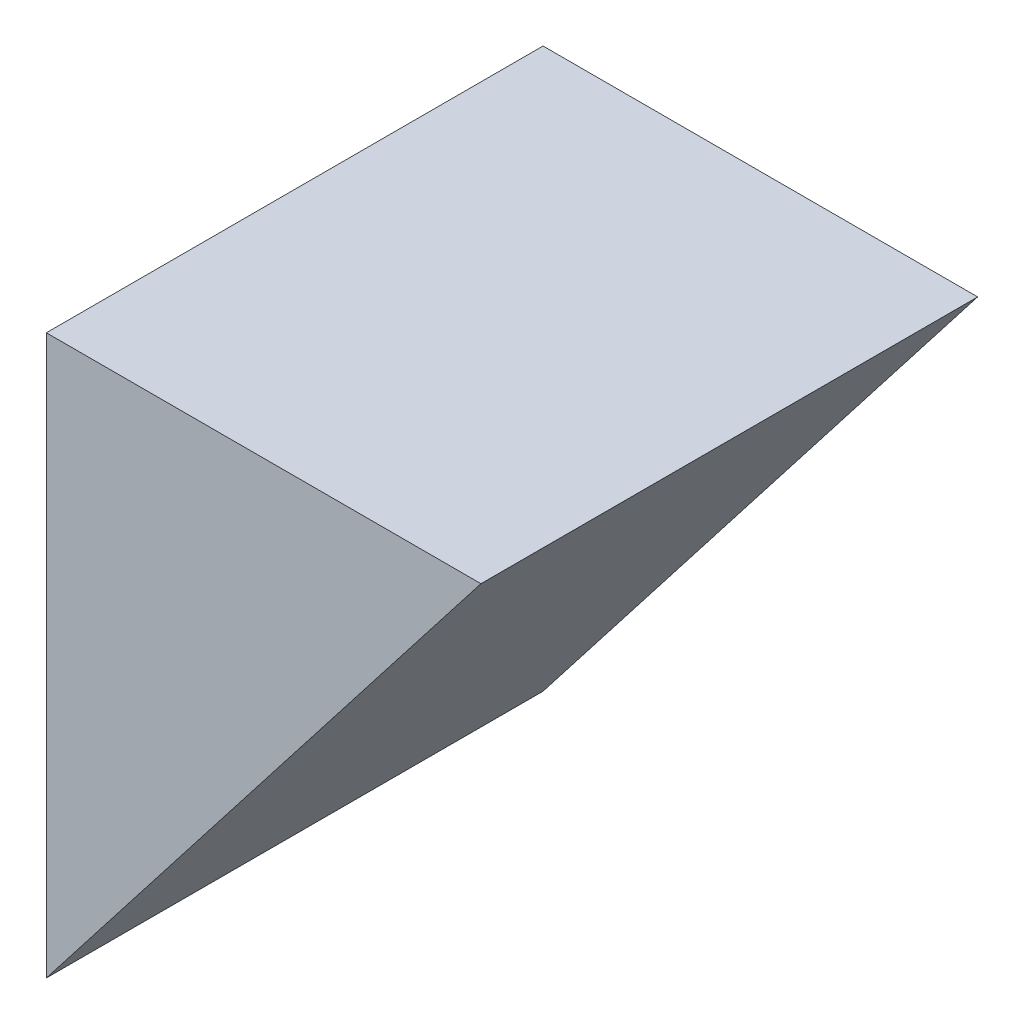
ISO-10303-21;
HEADER;
FILE_DESCRIPTION(('STEP AP214'),'2;1');
FILE_NAME('part.step','',(''),(''),'','','');
FILE_SCHEMA(('AUTOMOTIVE_DESIGN { 1 0 10303 214 1 1 1 1 }'));
ENDSEC;
DATA;
#1=APPLICATION_CONTEXT('core data for automotive mechanical design processes');
#2=APPLICATION_PROTOCOL_DEFINITION('international standard','automotive_design',2000,#1);
#3=PRODUCT_CONTEXT('',#1,'mechanical');
#4=PRODUCT('Part','Part','',(#3));
#5=PRODUCT_RELATED_PRODUCT_CATEGORY('part','',(#4));
#6=PRODUCT_DEFINITION_FORMATION('','',#4);
#7=PRODUCT_DEFINITION_CONTEXT('part definition',#1,'design');
#8=PRODUCT_DEFINITION('design','',#6,#7);
#9=PRODUCT_DEFINITION_SHAPE('','',#8);
#10=(LENGTH_UNIT() NAMED_UNIT(*) SI_UNIT(.MILLI.,.METRE.));
#11=(NAMED_UNIT(*) PLANE_ANGLE_UNIT() SI_UNIT($,.RADIAN.));
#12=(NAMED_UNIT(*) SI_UNIT($,.STERADIAN.) SOLID_ANGLE_UNIT());
#13=UNCERTAINTY_MEASURE_WITH_UNIT(LENGTH_MEASURE(1.E-05),#10,'distance_accuracy_value','');
#14=(GEOMETRIC_REPRESENTATION_CONTEXT(3) GLOBAL_UNCERTAINTY_ASSIGNED_CONTEXT((#13)) GLOBAL_UNIT_ASSIGNED_CONTEXT((#10,
#11,#12)) REPRESENTATION_CONTEXT('',''));
#15=CARTESIAN_POINT('',(0.,0.,0.));
#16=DIRECTION('',(0.,0.,1.));
#17=DIRECTION('',(1.,0.,0.));
#18=AXIS2_PLACEMENT_3D('',#15,#16,#17);
#19=CARTESIAN_POINT('',(-1.57727562282662,-13.1481471085735,-16.));
#20=DIRECTION('',(0.,-1.,0.));
#21=DIRECTION('',(0.,0.,-1.));
#22=AXIS2_PLACEMENT_3D('',#19,#20,#21);
#23=PLANE('',#22);
#24=DIRECTION('',(-1.,0.,0.));
#25=VECTOR('',#24,1.);
#26=CARTESIAN_POINT('',(-1.57727562282662,-13.1481471085735,-24.));
#27=LINE('',#26,#25);
#28=CARTESIAN_POINT('',(-1.57727562282662,-13.1481471085735,-24.));
#29=VERTEX_POINT('',#28);
#30=CARTESIAN_POINT('',(-8.57727562282662,-13.1481471085735,-24.));
#31=VERTEX_POINT('',#30);
#32=EDGE_CURVE('E79',#29,#31,#27,.T.);
#33=ORIENTED_EDGE('',*,*,#32,.T.);
#34=DIRECTION('',(0.,0.,-1.));
#35=VECTOR('',#34,1.);
#36=CARTESIAN_POINT('',(-8.57727562282662,-13.1481471085735,-16.));
#37=LINE('',#36,#35);
#38=CARTESIAN_POINT('',(-8.57727562282662,-13.1481471085735,-16.));
#39=VERTEX_POINT('',#38);
#40=EDGE_CURVE('E11',#39,#31,#37,.T.);
#41=ORIENTED_EDGE('',*,*,#40,.F.);
#42=DIRECTION('',(-1.,0.,0.));
#43=VECTOR('',#42,1.);
#44=CARTESIAN_POINT('',(-1.57727562282662,-13.1481471085735,-16.));
#45=LINE('',#44,#43);
#46=CARTESIAN_POINT('',(-1.57727562282662,-13.1481471085735,-16.));
#47=VERTEX_POINT('',#46);
#48=EDGE_CURVE('E72',#47,#39,#45,.T.);
#49=ORIENTED_EDGE('',*,*,#48,.F.);
#50=DIRECTION('',(0.,0.,-1.));
#51=VECTOR('',#50,1.);
#52=CARTESIAN_POINT('',(-1.57727562282662,-13.1481471085735,-16.));
#53=LINE('',#52,#51);
#54=EDGE_CURVE('E80',#47,#29,#53,.T.);
#55=ORIENTED_EDGE('',*,*,#54,.T.);
#56=EDGE_LOOP('',(#33,#41,#49,#55));
#57=FACE_BOUND('',#56,.T.);
#58=ADVANCED_FACE('F32',(#57),#23,.F.);
#59=CARTESIAN_POINT('',(-8.57727562282662,-13.1481471085735,-16.));
#60=DIRECTION('',(1.,0.,0.));
#61=DIRECTION('',(0.,0.,-1.));
#62=AXIS2_PLACEMENT_3D('',#59,#60,#61);
#63=PLANE('',#62);
#64=DIRECTION('',(0.,-1.,0.));
#65=VECTOR('',#64,1.);
#66=CARTESIAN_POINT('',(-8.57727562282662,-13.1481471085735,-24.));
#67=LINE('',#66,#65);
#68=CARTESIAN_POINT('',(-8.57727562282662,-22.1481471085735,-24.));
#69=VERTEX_POINT('',#68);
#70=EDGE_CURVE('E60',#31,#69,#67,.T.);
#71=ORIENTED_EDGE('',*,*,#70,.T.);
#72=DIRECTION('',(0.,0.,-1.));
#73=VECTOR('',#72,1.);
#74=CARTESIAN_POINT('',(-8.57727562282662,-22.1481471085735,-16.));
#75=LINE('',#74,#73);
#76=CARTESIAN_POINT('',(-8.57727562282662,-22.1481471085735,-16.));
#77=VERTEX_POINT('',#76);
#78=EDGE_CURVE('E40',#77,#69,#75,.T.);
#79=ORIENTED_EDGE('',*,*,#78,.F.);
#80=DIRECTION('',(0.,-1.,0.));
#81=VECTOR('',#80,1.);
#82=CARTESIAN_POINT('',(-8.57727562282662,-13.1481471085735,-16.));
#83=LINE('',#82,#81);
#84=EDGE_CURVE('E68',#39,#77,#83,.T.);
#85=ORIENTED_EDGE('',*,*,#84,.F.);
#86=ORIENTED_EDGE('',*,*,#40,.T.);
#87=EDGE_LOOP('',(#71,#79,#85,#86));
#88=FACE_BOUND('',#87,.T.);
#89=ADVANCED_FACE('F69',(#88),#63,.F.);
#90=CARTESIAN_POINT('',(-8.57727562282662,-22.1481471085735,-16.));
#91=DIRECTION('',(-0.789352217376326,0.61394061351492,0.));
#92=DIRECTION('',(-0.61394061351492,-0.789352217376326,0.));
#93=AXIS2_PLACEMENT_3D('',#90,#91,#92);
#94=PLANE('',#93);
#95=DIRECTION('',(0.61394061351492,0.789352217376326,0.));
#96=VECTOR('',#95,1.);
#97=CARTESIAN_POINT('',(-8.57727562282662,-22.1481471085735,-24.));
#98=LINE('',#97,#96);
#99=EDGE_CURVE('E65',#69,#29,#98,.T.);
#100=ORIENTED_EDGE('',*,*,#99,.T.);
#101=ORIENTED_EDGE('',*,*,#54,.F.);
#102=DIRECTION('',(0.61394061351492,0.789352217376326,0.));
#103=VECTOR('',#102,1.);
#104=CARTESIAN_POINT('',(-8.57727562282662,-22.1481471085735,-16.));
#105=LINE('',#104,#103);
#106=EDGE_CURVE('E48',#77,#47,#105,.T.);
#107=ORIENTED_EDGE('',*,*,#106,.F.);
#108=ORIENTED_EDGE('',*,*,#78,.T.);
#109=EDGE_LOOP('',(#100,#101,#107,#108));
#110=FACE_BOUND('',#109,.T.);
#111=ADVANCED_FACE('F87',(#110),#94,.F.);
#112=CARTESIAN_POINT('',(0.,0.,-16.));
#113=DIRECTION('',(0.,0.,1.));
#114=DIRECTION('',(1.,0.,0.));
#115=AXIS2_PLACEMENT_3D('',#112,#113,#114);
#116=PLANE('',#115);
#117=ORIENTED_EDGE('',*,*,#48,.T.);
#118=ORIENTED_EDGE('',*,*,#84,.T.);
#119=ORIENTED_EDGE('',*,*,#106,.T.);
#120=EDGE_LOOP('',(#117,#118,#119));
#121=FACE_BOUND('',#120,.T.);
#122=ADVANCED_FACE('F75',(#121),#116,.T.);
#123=CARTESIAN_POINT('',(0.,0.,-24.));
#124=DIRECTION('',(0.,0.,1.));
#125=DIRECTION('',(1.,0.,0.));
#126=AXIS2_PLACEMENT_3D('',#123,#124,#125);
#127=PLANE('',#126);
#128=ORIENTED_EDGE('',*,*,#32,.F.);
#129=ORIENTED_EDGE('',*,*,#99,.F.);
#130=ORIENTED_EDGE('',*,*,#70,.F.);
#131=EDGE_LOOP('',(#128,#129,#130));
#132=FACE_BOUND('',#131,.T.);
#133=ADVANCED_FACE('F88',(#132),#127,.F.);
#134=CLOSED_SHELL('',(#58,#89,#111,#122,#133));
#135=MANIFOLD_SOLID_BREP('B2',#134);
#136=ADVANCED_BREP_SHAPE_REPRESENTATION('',(#18,#135),#14);
#137=SHAPE_DEFINITION_REPRESENTATION(#9,#136);
ENDSEC;
END-ISO-10303-21;
